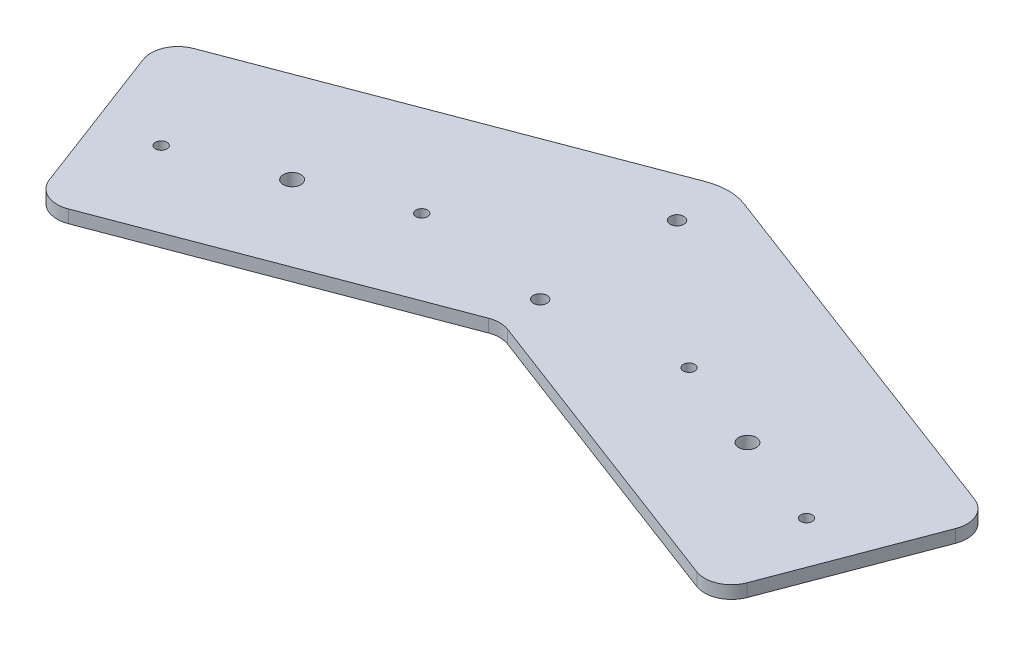
ISO-10303-21;
HEADER;
FILE_DESCRIPTION(('STEP AP214'),'2;1');
FILE_NAME('part.step','',(''),(''),'','','');
FILE_SCHEMA(('AUTOMOTIVE_DESIGN { 1 0 10303 214 1 1 1 1 }'));
ENDSEC;
DATA;
#1=APPLICATION_CONTEXT('core data for automotive mechanical design processes');
#2=APPLICATION_PROTOCOL_DEFINITION('international standard','automotive_design',2000,#1);
#3=PRODUCT_CONTEXT('',#1,'mechanical');
#4=PRODUCT('Part','Part','',(#3));
#5=PRODUCT_RELATED_PRODUCT_CATEGORY('part','',(#4));
#6=PRODUCT_DEFINITION_FORMATION('','',#4);
#7=PRODUCT_DEFINITION_CONTEXT('part definition',#1,'design');
#8=PRODUCT_DEFINITION('design','',#6,#7);
#9=PRODUCT_DEFINITION_SHAPE('','',#8);
#10=(LENGTH_UNIT() NAMED_UNIT(*) SI_UNIT(.MILLI.,.METRE.));
#11=(NAMED_UNIT(*) PLANE_ANGLE_UNIT() SI_UNIT($,.RADIAN.));
#12=(NAMED_UNIT(*) SI_UNIT($,.STERADIAN.) SOLID_ANGLE_UNIT());
#13=UNCERTAINTY_MEASURE_WITH_UNIT(LENGTH_MEASURE(1.E-05),#10,'distance_accuracy_value','');
#14=(GEOMETRIC_REPRESENTATION_CONTEXT(3) GLOBAL_UNCERTAINTY_ASSIGNED_CONTEXT((#13)) GLOBAL_UNIT_ASSIGNED_CONTEXT((#10,
#11,#12)) REPRESENTATION_CONTEXT('',''));
#15=CARTESIAN_POINT('',(0.,0.,0.));
#16=DIRECTION('',(0.,0.,1.));
#17=DIRECTION('',(1.,0.,0.));
#18=AXIS2_PLACEMENT_3D('',#15,#16,#17);
#19=CARTESIAN_POINT('',(0.00013176790799323,0.,-110.207283227998));
#20=DIRECTION('',(0.,-1.,0.));
#21=DIRECTION('',(0.,0.,-1.));
#22=AXIS2_PLACEMENT_3D('',#19,#20,#21);
#23=PLANE('',#22);
#24=CARTESIAN_POINT('',(-2.9012140517437E-06,0.,-111.151797866301));
#25=DIRECTION('',(0.,1.,0.));
#26=DIRECTION('',(0.,0.,1.));
#27=AXIS2_PLACEMENT_3D('',#24,#25,#26);
#28=CIRCLE('',#27,2.5527);
#29=CARTESIAN_POINT('',(-2.9012140517437E-06,0.,-108.599097866301));
#30=VERTEX_POINT('',#29);
#31=EDGE_CURVE('E307',#30,#30,#28,.T.);
#32=ORIENTED_EDGE('',*,*,#31,.F.);
#33=EDGE_LOOP('',(#32));
#34=FACE_BOUND('',#33,.T.);
#35=CARTESIAN_POINT('',(-49.6107508602278,0.,-66.0141406287206));
#36=DIRECTION('',(0.,1.,0.));
#37=DIRECTION('',(0.,0.,1.));
#38=AXIS2_PLACEMENT_3D('',#35,#36,#37);
#39=CIRCLE('',#38,2.15);
#40=CARTESIAN_POINT('',(-49.6107508602278,0.,-63.8641406287206));
#41=VERTEX_POINT('',#40);
#42=EDGE_CURVE('E321',#41,#41,#39,.T.);
#43=ORIENTED_EDGE('',*,*,#42,.F.);
#44=EDGE_LOOP('',(#43));
#45=FACE_BOUND('',#44,.T.);
#46=CARTESIAN_POINT('',(-119.745946152243,0.,-39.4424568157338));
#47=DIRECTION('',(0.,1.,0.));
#48=DIRECTION('',(0.,0.,1.));
#49=AXIS2_PLACEMENT_3D('',#46,#47,#48);
#50=CIRCLE('',#49,2.15);
#51=CARTESIAN_POINT('',(-119.745946152243,0.,-37.2924568157338));
#52=VERTEX_POINT('',#51);
#53=EDGE_CURVE('E329',#52,#52,#50,.T.);
#54=ORIENTED_EDGE('',*,*,#53,.F.);
#55=EDGE_LOOP('',(#54));
#56=FACE_BOUND('',#55,.T.);
#57=CARTESIAN_POINT('',(49.6106662182509,0.,-66.0140000016194));
#58=DIRECTION('',(0.,1.,0.));
#59=DIRECTION('',(0.,0.,1.));
#60=AXIS2_PLACEMENT_3D('',#57,#58,#59);
#61=CIRCLE('',#60,2.15);
#62=CARTESIAN_POINT('',(49.6106662182509,0.,-63.8640000016194));
#63=VERTEX_POINT('',#62);
#64=EDGE_CURVE('E337',#63,#63,#61,.T.);
#65=ORIENTED_EDGE('',*,*,#64,.F.);
#66=EDGE_LOOP('',(#65));
#67=FACE_BOUND('',#66,.T.);
#68=CARTESIAN_POINT('',(119.745752361562,0.,-39.4420281216076));
#69=DIRECTION('',(0.,1.,0.));
#70=DIRECTION('',(0.,0.,1.));
#71=AXIS2_PLACEMENT_3D('',#68,#69,#70);
#72=CIRCLE('',#71,2.15);
#73=CARTESIAN_POINT('',(119.745752361562,0.,-37.2920281216076));
#74=VERTEX_POINT('',#73);
#75=EDGE_CURVE('E345',#74,#74,#72,.T.);
#76=ORIENTED_EDGE('',*,*,#75,.F.);
#77=EDGE_LOOP('',(#76));
#78=FACE_BOUND('',#77,.T.);
#79=CARTESIAN_POINT('',(84.4997864608862,0.,-52.7959249176631));
#80=DIRECTION('',(0.,1.,0.));
#81=DIRECTION('',(0.,0.,1.));
#82=AXIS2_PLACEMENT_3D('',#79,#80,#81);
#83=CIRCLE('',#82,3.26389999999999);
#84=CARTESIAN_POINT('',(84.4997864608862,0.,-49.5320249176631));
#85=VERTEX_POINT('',#84);
#86=EDGE_CURVE('E353',#85,#85,#83,.T.);
#87=ORIENTED_EDGE('',*,*,#86,.F.);
#88=EDGE_LOOP('',(#87));
#89=FACE_BOUND('',#88,.T.);
#90=CARTESIAN_POINT('',(-84.4998511081356,0.,-52.795924917663));
#91=DIRECTION('',(0.,1.,0.));
#92=DIRECTION('',(0.,0.,1.));
#93=AXIS2_PLACEMENT_3D('',#90,#91,#92);
#94=CIRCLE('',#93,3.26389999999999);
#95=CARTESIAN_POINT('',(-84.4998511081356,0.,-49.5320249176631));
#96=VERTEX_POINT('',#95);
#97=EDGE_CURVE('E361',#96,#96,#94,.T.);
#98=ORIENTED_EDGE('',*,*,#97,.F.);
#99=EDGE_LOOP('',(#98));
#100=FACE_BOUND('',#99,.T.);
#101=CARTESIAN_POINT('',(0.00013176790799323,0.,-110.207283227998));
#102=DIRECTION('',(0.,-1.,0.));
#103=DIRECTION('',(0.,0.,-1.));
#104=AXIS2_PLACEMENT_3D('',#101,#102,#103);
#105=CIRCLE('',#104,20.);
#106=CARTESIAN_POINT('',(-7.08565058265872,0.,-128.910001973689));
#107=VERTEX_POINT('',#106);
#108=CARTESIAN_POINT('',(7.08599093722021,0.,-128.909972869669));
#109=VERTEX_POINT('',#108);
#110=EDGE_CURVE('E167',#107,#109,#105,.T.);
#111=ORIENTED_EDGE('',*,*,#110,.F.);
#112=DIRECTION('',(-0.935135937284519,0.,0.354289117528332));
#113=VECTOR('',#112,1.);
#114=CARTESIAN_POINT('',(-7.08565058265872,0.,-128.910001973689));
#115=LINE('',#114,#113);
#116=CARTESIAN_POINT('',(-144.945894588557,0.,-76.6797515430182));
#117=VERTEX_POINT('',#116);
#118=EDGE_CURVE('E208',#107,#117,#115,.T.);
#119=ORIENTED_EDGE('',*,*,#118,.T.);
#120=CARTESIAN_POINT('',(-141.403003413273,0.,-67.3283921701731));
#121=DIRECTION('',(0.,1.,0.));
#122=DIRECTION('',(0.,0.,1.));
#123=AXIS2_PLACEMENT_3D('',#120,#121,#122);
#124=CIRCLE('',#123,9.99999999999998);
#125=CARTESIAN_POINT('',(-150.754362786118,0.,-63.7855009948898));
#126=VERTEX_POINT('',#125);
#127=EDGE_CURVE('E205',#117,#126,#124,.T.);
#128=ORIENTED_EDGE('',*,*,#127,.T.);
#129=DIRECTION('',(0.354289117528333,0.,0.935135937284519));
#130=VECTOR('',#129,1.);
#131=CARTESIAN_POINT('',(-150.754362786118,0.,-63.7855009948898));
#132=LINE('',#131,#130);
#133=CARTESIAN_POINT('',(-129.497015734418,0.,-7.67734475781865));
#134=VERTEX_POINT('',#133);
#135=EDGE_CURVE('E143',#126,#134,#132,.T.);
#136=ORIENTED_EDGE('',*,*,#135,.T.);
#137=CARTESIAN_POINT('',(-120.145656361573,0.,-11.220235933102));
#138=DIRECTION('',(0.,1.,0.));
#139=DIRECTION('',(0.,0.,1.));
#140=AXIS2_PLACEMENT_3D('',#137,#138,#139);
#141=CIRCLE('',#140,10.);
#142=CARTESIAN_POINT('',(-116.60276518629,0.,-1.86887656025678));
#143=VERTEX_POINT('',#142);
#144=EDGE_CURVE('E199',#134,#143,#141,.T.);
#145=ORIENTED_EDGE('',*,*,#144,.T.);
#146=DIRECTION('',(0.935135937284519,0.,-0.354289117528332));
#147=VECTOR('',#146,1.);
#148=CARTESIAN_POINT('',(-116.60276518629,0.,-1.86887656025677));
#149=LINE('',#148,#147);
#150=CARTESIAN_POINT('',(-3.54291313660133,0.,-44.7031572391531));
#151=VERTEX_POINT('',#150);
#152=EDGE_CURVE('E195',#143,#151,#149,.T.);
#153=ORIENTED_EDGE('',*,*,#152,.T.);
#154=CARTESIAN_POINT('',(-2.19613180141298E-05,0.,-35.351797866308));
#155=DIRECTION('',(0.,-1.,0.));
#156=DIRECTION('',(0.,0.,-1.));
#157=AXIS2_PLACEMENT_3D('',#154,#155,#156);
#158=CIRCLE('',#157,9.99999999999999);
#159=CARTESIAN_POINT('',(3.54290762333806,0.,-44.7031426871436));
#160=VERTEX_POINT('',#159);
#161=EDGE_CURVE('E191',#151,#160,#158,.T.);
#162=ORIENTED_EDGE('',*,*,#161,.T.);
#163=DIRECTION('',(0.93513448208356,0.,0.354292958465607));
#164=VECTOR('',#163,1.);
#165=CARTESIAN_POINT('',(3.54290762333805,0.,-44.7031426871436));
#166=LINE('',#165,#164);
#167=CARTESIAN_POINT('',(116.602583736247,0.,-1.86839763105588));
#168=VERTEX_POINT('',#167);
#169=EDGE_CURVE('E187',#160,#168,#166,.T.);
#170=ORIENTED_EDGE('',*,*,#169,.T.);
#171=CARTESIAN_POINT('',(120.145513320903,0.,-11.2197424518915));
#172=DIRECTION('',(0.,1.,0.));
#173=DIRECTION('',(0.,0.,1.));
#174=AXIS2_PLACEMENT_3D('',#171,#172,#173);
#175=CIRCLE('',#174,10.);
#176=CARTESIAN_POINT('',(129.496858141739,0.,-7.6768128672354));
#177=VERTEX_POINT('',#176);
#178=EDGE_CURVE('E183',#168,#177,#175,.T.);
#179=ORIENTED_EDGE('',*,*,#178,.T.);
#180=DIRECTION('',(0.354292958465607,0.,-0.93513448208356));
#181=VECTOR('',#180,1.);
#182=CARTESIAN_POINT('',(129.496858141739,0.,-7.6768128672354));
#183=LINE('',#182,#181);
#184=CARTESIAN_POINT('',(150.754435649675,0.,-63.784881792249));
#185=VERTEX_POINT('',#184);
#186=EDGE_CURVE('E179',#177,#185,#183,.T.);
#187=ORIENTED_EDGE('',*,*,#186,.T.);
#188=CARTESIAN_POINT('',(141.40309082884,0.,-67.3278113769051));
#189=DIRECTION('',(0.,-1.,0.));
#190=DIRECTION('',(0.,0.,-1.));
#191=AXIS2_PLACEMENT_3D('',#188,#189,#190);
#192=CIRCLE('',#191,10.);
#193=CARTESIAN_POINT('',(144.946020413496,0.,-76.6791561977407));
#194=VERTEX_POINT('',#193);
#195=EDGE_CURVE('E175',#194,#185,#192,.T.);
#196=ORIENTED_EDGE('',*,*,#195,.F.);
#197=DIRECTION('',(-0.93513448208356,0.,-0.354292958465607));
#198=VECTOR('',#197,1.);
#199=CARTESIAN_POINT('',(144.946020413496,0.,-76.6791561977407));
#200=LINE('',#199,#198);
#201=EDGE_CURVE('E170',#194,#109,#200,.T.);
#202=ORIENTED_EDGE('',*,*,#201,.T.);
#203=EDGE_LOOP('',(#111,#119,#128,#136,#145,#153,#162,#170,#179,#187,#196,#202));
#204=FACE_BOUND('',#203,.T.);
#205=CARTESIAN_POINT('',(-2.9012140517437E-06,0.,-60.3517978663007));
#206=DIRECTION('',(0.,1.,0.));
#207=DIRECTION('',(0.,0.,1.));
#208=AXIS2_PLACEMENT_3D('',#205,#206,#207);
#209=CIRCLE('',#208,2.5527);
#210=CARTESIAN_POINT('',(-2.9012140517437E-06,0.,-57.7990978663007));
#211=VERTEX_POINT('',#210);
#212=EDGE_CURVE('E311',#211,#211,#209,.T.);
#213=ORIENTED_EDGE('',*,*,#212,.F.);
#214=EDGE_LOOP('',(#213));
#215=FACE_BOUND('',#214,.T.);
#216=ADVANCED_FACE('F42',(#34,#45,#56,#67,#78,#89,#100,#204,#215),#23,.F.);
#217=CARTESIAN_POINT('',(0.00013176790799323,-4.7625,-110.207283227998));
#218=DIRECTION('',(0.,1.,0.));
#219=DIRECTION('',(0.,0.,1.));
#220=AXIS2_PLACEMENT_3D('',#217,#218,#219);
#221=CYLINDRICAL_SURFACE('',#220,20.);
#222=ORIENTED_EDGE('',*,*,#110,.T.);
#223=DIRECTION('',(0.,1.,0.));
#224=VECTOR('',#223,1.);
#225=CARTESIAN_POINT('',(7.08599093722021,-4.7625,-128.909972869669));
#226=LINE('',#225,#224);
#227=CARTESIAN_POINT('',(7.08599093722021,-4.7625,-128.909972869669));
#228=VERTEX_POINT('',#227);
#229=EDGE_CURVE('E11',#228,#109,#226,.T.);
#230=ORIENTED_EDGE('',*,*,#229,.F.);
#231=CARTESIAN_POINT('',(0.00013176790799323,-4.7625,-110.207283227998));
#232=DIRECTION('',(0.,-1.,0.));
#233=DIRECTION('',(0.,0.,-1.));
#234=AXIS2_PLACEMENT_3D('',#231,#232,#233);
#235=CIRCLE('',#234,20.);
#236=CARTESIAN_POINT('',(-7.08565058265872,-4.7625,-128.910001973689));
#237=VERTEX_POINT('',#236);
#238=EDGE_CURVE('E109',#237,#228,#235,.T.);
#239=ORIENTED_EDGE('',*,*,#238,.F.);
#240=DIRECTION('',(0.,1.,0.));
#241=VECTOR('',#240,1.);
#242=CARTESIAN_POINT('',(-7.08565058265872,-4.7625,-128.910001973689));
#243=LINE('',#242,#241);
#244=EDGE_CURVE('E60',#237,#107,#243,.T.);
#245=ORIENTED_EDGE('',*,*,#244,.T.);
#246=EDGE_LOOP('',(#222,#230,#239,#245));
#247=FACE_BOUND('',#246,.T.);
#248=ADVANCED_FACE('F44',(#247),#221,.T.);
#249=CARTESIAN_POINT('',(144.946020413496,-4.7625,-76.6791561977407));
#250=DIRECTION('',(0.354292958465607,0.,-0.93513448208356));
#251=DIRECTION('',(-0.93513448208356,0.,-0.354292958465607));
#252=AXIS2_PLACEMENT_3D('',#249,#250,#251);
#253=PLANE('',#252);
#254=ORIENTED_EDGE('',*,*,#201,.F.);
#255=DIRECTION('',(0.,1.,0.));
#256=VECTOR('',#255,1.);
#257=CARTESIAN_POINT('',(144.946020413496,-4.7625,-76.6791561977407));
#258=LINE('',#257,#256);
#259=CARTESIAN_POINT('',(144.946020413496,-4.7625,-76.6791561977407));
#260=VERTEX_POINT('',#259);
#261=EDGE_CURVE('E52',#260,#194,#258,.T.);
#262=ORIENTED_EDGE('',*,*,#261,.F.);
#263=DIRECTION('',(-0.93513448208356,0.,-0.354292958465607));
#264=VECTOR('',#263,1.);
#265=CARTESIAN_POINT('',(144.946020413496,-4.7625,-76.6791561977407));
#266=LINE('',#265,#264);
#267=EDGE_CURVE('E249',#260,#228,#266,.T.);
#268=ORIENTED_EDGE('',*,*,#267,.T.);
#269=ORIENTED_EDGE('',*,*,#229,.T.);
#270=EDGE_LOOP('',(#254,#262,#268,#269));
#271=FACE_BOUND('',#270,.T.);
#272=ADVANCED_FACE('F248',(#271),#253,.T.);
#273=CARTESIAN_POINT('',(141.40309082884,-4.7625,-67.3278113769051));
#274=DIRECTION('',(0.,1.,0.));
#275=DIRECTION('',(0.,0.,1.));
#276=AXIS2_PLACEMENT_3D('',#273,#274,#275);
#277=CYLINDRICAL_SURFACE('',#276,10.);
#278=ORIENTED_EDGE('',*,*,#195,.T.);
#279=DIRECTION('',(0.,1.,0.));
#280=VECTOR('',#279,1.);
#281=CARTESIAN_POINT('',(150.754435649675,-4.7625,-63.784881792249));
#282=LINE('',#281,#280);
#283=CARTESIAN_POINT('',(150.754435649675,-4.7625,-63.784881792249));
#284=VERTEX_POINT('',#283);
#285=EDGE_CURVE('E233',#284,#185,#282,.T.);
#286=ORIENTED_EDGE('',*,*,#285,.F.);
#287=CARTESIAN_POINT('',(141.40309082884,-4.7625,-67.3278113769051));
#288=DIRECTION('',(0.,-1.,0.));
#289=DIRECTION('',(0.,0.,-1.));
#290=AXIS2_PLACEMENT_3D('',#287,#288,#289);
#291=CIRCLE('',#290,10.);
#292=EDGE_CURVE('E241',#260,#284,#291,.T.);
#293=ORIENTED_EDGE('',*,*,#292,.F.);
#294=ORIENTED_EDGE('',*,*,#261,.T.);
#295=EDGE_LOOP('',(#278,#286,#293,#294));
#296=FACE_BOUND('',#295,.T.);
#297=ADVANCED_FACE('F239',(#296),#277,.T.);
#298=CARTESIAN_POINT('',(129.496858141739,-4.7625,-7.6768128672354));
#299=DIRECTION('',(0.93513448208356,0.,0.354292958465607));
#300=DIRECTION('',(0.354292958465607,0.,-0.93513448208356));
#301=AXIS2_PLACEMENT_3D('',#298,#299,#300);
#302=PLANE('',#301);
#303=ORIENTED_EDGE('',*,*,#186,.F.);
#304=DIRECTION('',(0.,1.,0.));
#305=VECTOR('',#304,1.);
#306=CARTESIAN_POINT('',(129.496858141739,-4.7625,-7.6768128672354));
#307=LINE('',#306,#305);
#308=CARTESIAN_POINT('',(129.496858141739,-4.7625,-7.6768128672354));
#309=VERTEX_POINT('',#308);
#310=EDGE_CURVE('E230',#309,#177,#307,.T.);
#311=ORIENTED_EDGE('',*,*,#310,.F.);
#312=DIRECTION('',(0.354292958465607,0.,-0.93513448208356));
#313=VECTOR('',#312,1.);
#314=CARTESIAN_POINT('',(129.496858141739,-4.7625,-7.6768128672354));
#315=LINE('',#314,#313);
#316=EDGE_CURVE('E374',#309,#284,#315,.T.);
#317=ORIENTED_EDGE('',*,*,#316,.T.);
#318=ORIENTED_EDGE('',*,*,#285,.T.);
#319=EDGE_LOOP('',(#303,#311,#317,#318));
#320=FACE_BOUND('',#319,.T.);
#321=ADVANCED_FACE('F414',(#320),#302,.T.);
#322=CARTESIAN_POINT('',(120.145513320903,-4.7625,-11.2197424518915));
#323=DIRECTION('',(0.,1.,0.));
#324=DIRECTION('',(0.,0.,1.));
#325=AXIS2_PLACEMENT_3D('',#322,#323,#324);
#326=CYLINDRICAL_SURFACE('',#325,10.);
#327=ORIENTED_EDGE('',*,*,#178,.F.);
#328=DIRECTION('',(0.,1.,0.));
#329=VECTOR('',#328,1.);
#330=CARTESIAN_POINT('',(116.602583736247,-4.7625,-1.86839763105588));
#331=LINE('',#330,#329);
#332=CARTESIAN_POINT('',(116.602583736247,-4.7625,-1.86839763105588));
#333=VERTEX_POINT('',#332);
#334=EDGE_CURVE('E227',#333,#168,#331,.T.);
#335=ORIENTED_EDGE('',*,*,#334,.F.);
#336=CARTESIAN_POINT('',(120.145513320903,-4.7625,-11.2197424518915));
#337=DIRECTION('',(0.,1.,0.));
#338=DIRECTION('',(0.,0.,1.));
#339=AXIS2_PLACEMENT_3D('',#336,#337,#338);
#340=CIRCLE('',#339,10.);
#341=EDGE_CURVE('E378',#333,#309,#340,.T.);
#342=ORIENTED_EDGE('',*,*,#341,.T.);
#343=ORIENTED_EDGE('',*,*,#310,.T.);
#344=EDGE_LOOP('',(#327,#335,#342,#343));
#345=FACE_BOUND('',#344,.T.);
#346=ADVANCED_FACE('F410',(#345),#326,.T.);
#347=CARTESIAN_POINT('',(3.54290762333805,-4.7625,-44.7031426871436));
#348=DIRECTION('',(-0.354292958465607,0.,0.93513448208356));
#349=DIRECTION('',(0.93513448208356,0.,0.354292958465607));
#350=AXIS2_PLACEMENT_3D('',#347,#348,#349);
#351=PLANE('',#350);
#352=ORIENTED_EDGE('',*,*,#169,.F.);
#353=DIRECTION('',(0.,1.,0.));
#354=VECTOR('',#353,1.);
#355=CARTESIAN_POINT('',(3.54290762333806,-4.7625,-44.7031426871436));
#356=LINE('',#355,#354);
#357=CARTESIAN_POINT('',(3.54290762333806,-4.7625,-44.7031426871436));
#358=VERTEX_POINT('',#357);
#359=EDGE_CURVE('E224',#358,#160,#356,.T.);
#360=ORIENTED_EDGE('',*,*,#359,.F.);
#361=DIRECTION('',(0.93513448208356,0.,0.354292958465607));
#362=VECTOR('',#361,1.);
#363=CARTESIAN_POINT('',(3.54290762333805,-4.7625,-44.7031426871436));
#364=LINE('',#363,#362);
#365=EDGE_CURVE('E382',#358,#333,#364,.T.);
#366=ORIENTED_EDGE('',*,*,#365,.T.);
#367=ORIENTED_EDGE('',*,*,#334,.T.);
#368=EDGE_LOOP('',(#352,#360,#366,#367));
#369=FACE_BOUND('',#368,.T.);
#370=ADVANCED_FACE('F407',(#369),#351,.T.);
#371=CARTESIAN_POINT('',(-2.19613180141298E-05,-4.7625,-35.351797866308));
#372=DIRECTION('',(0.,1.,0.));
#373=DIRECTION('',(0.,0.,1.));
#374=AXIS2_PLACEMENT_3D('',#371,#372,#373);
#375=CYLINDRICAL_SURFACE('',#374,9.99999999999999);
#376=ORIENTED_EDGE('',*,*,#161,.F.);
#377=DIRECTION('',(0.,1.,0.));
#378=VECTOR('',#377,1.);
#379=CARTESIAN_POINT('',(-3.54291313660133,-4.7625,-44.7031572391531));
#380=LINE('',#379,#378);
#381=CARTESIAN_POINT('',(-3.54291313660133,-4.7625,-44.7031572391531));
#382=VERTEX_POINT('',#381);
#383=EDGE_CURVE('E221',#382,#151,#380,.T.);
#384=ORIENTED_EDGE('',*,*,#383,.F.);
#385=CARTESIAN_POINT('',(-2.19613180141298E-05,-4.7625,-35.351797866308));
#386=DIRECTION('',(0.,-1.,0.));
#387=DIRECTION('',(0.,0.,-1.));
#388=AXIS2_PLACEMENT_3D('',#385,#386,#387);
#389=CIRCLE('',#388,9.99999999999999);
#390=EDGE_CURVE('E386',#382,#358,#389,.T.);
#391=ORIENTED_EDGE('',*,*,#390,.T.);
#392=ORIENTED_EDGE('',*,*,#359,.T.);
#393=EDGE_LOOP('',(#376,#384,#391,#392));
#394=FACE_BOUND('',#393,.T.);
#395=ADVANCED_FACE('F403',(#394),#375,.F.);
#396=CARTESIAN_POINT('',(-116.60276518629,-4.7625,-1.86887656025677));
#397=DIRECTION('',(0.354289117528332,0.,0.935135937284519));
#398=DIRECTION('',(0.935135937284519,0.,-0.354289117528332));
#399=AXIS2_PLACEMENT_3D('',#396,#397,#398);
#400=PLANE('',#399);
#401=ORIENTED_EDGE('',*,*,#152,.F.);
#402=DIRECTION('',(0.,1.,0.));
#403=VECTOR('',#402,1.);
#404=CARTESIAN_POINT('',(-116.60276518629,-4.7625,-1.86887656025678));
#405=LINE('',#404,#403);
#406=CARTESIAN_POINT('',(-116.60276518629,-4.7625,-1.86887656025678));
#407=VERTEX_POINT('',#406);
#408=EDGE_CURVE('E218',#407,#143,#405,.T.);
#409=ORIENTED_EDGE('',*,*,#408,.F.);
#410=DIRECTION('',(0.935135937284519,0.,-0.354289117528332));
#411=VECTOR('',#410,1.);
#412=CARTESIAN_POINT('',(-116.60276518629,-4.7625,-1.86887656025677));
#413=LINE('',#412,#411);
#414=EDGE_CURVE('E390',#407,#382,#413,.T.);
#415=ORIENTED_EDGE('',*,*,#414,.T.);
#416=ORIENTED_EDGE('',*,*,#383,.T.);
#417=EDGE_LOOP('',(#401,#409,#415,#416));
#418=FACE_BOUND('',#417,.T.);
#419=ADVANCED_FACE('F400',(#418),#400,.T.);
#420=CARTESIAN_POINT('',(-120.145656361573,-4.7625,-11.220235933102));
#421=DIRECTION('',(0.,1.,0.));
#422=DIRECTION('',(0.,0.,1.));
#423=AXIS2_PLACEMENT_3D('',#420,#421,#422);
#424=CYLINDRICAL_SURFACE('',#423,10.);
#425=ORIENTED_EDGE('',*,*,#144,.F.);
#426=DIRECTION('',(0.,1.,0.));
#427=VECTOR('',#426,1.);
#428=CARTESIAN_POINT('',(-129.497015734418,-4.7625,-7.67734475781865));
#429=LINE('',#428,#427);
#430=CARTESIAN_POINT('',(-129.497015734418,-4.7625,-7.67734475781865));
#431=VERTEX_POINT('',#430);
#432=EDGE_CURVE('E148',#431,#134,#429,.T.);
#433=ORIENTED_EDGE('',*,*,#432,.F.);
#434=CARTESIAN_POINT('',(-120.145656361573,-4.7625,-11.220235933102));
#435=DIRECTION('',(0.,1.,0.));
#436=DIRECTION('',(0.,0.,1.));
#437=AXIS2_PLACEMENT_3D('',#434,#435,#436);
#438=CIRCLE('',#437,10.);
#439=EDGE_CURVE('E156',#431,#407,#438,.T.);
#440=ORIENTED_EDGE('',*,*,#439,.T.);
#441=ORIENTED_EDGE('',*,*,#408,.T.);
#442=EDGE_LOOP('',(#425,#433,#440,#441));
#443=FACE_BOUND('',#442,.T.);
#444=ADVANCED_FACE('F396',(#443),#424,.T.);
#445=CARTESIAN_POINT('',(-150.754362786118,-4.7625,-63.7855009948898));
#446=DIRECTION('',(-0.935135937284519,0.,0.354289117528333));
#447=DIRECTION('',(0.354289117528333,0.,0.935135937284519));
#448=AXIS2_PLACEMENT_3D('',#445,#446,#447);
#449=PLANE('',#448);
#450=ORIENTED_EDGE('',*,*,#135,.F.);
#451=DIRECTION('',(0.,1.,0.));
#452=VECTOR('',#451,1.);
#453=CARTESIAN_POINT('',(-150.754362786118,-4.7625,-63.7855009948898));
#454=LINE('',#453,#452);
#455=CARTESIAN_POINT('',(-150.754362786118,-4.7625,-63.7855009948898));
#456=VERTEX_POINT('',#455);
#457=EDGE_CURVE('E138',#456,#126,#454,.T.);
#458=ORIENTED_EDGE('',*,*,#457,.F.);
#459=DIRECTION('',(0.354289117528333,0.,0.935135937284519));
#460=VECTOR('',#459,1.);
#461=CARTESIAN_POINT('',(-150.754362786118,-4.7625,-63.7855009948898));
#462=LINE('',#461,#460);
#463=EDGE_CURVE('E141',#456,#431,#462,.T.);
#464=ORIENTED_EDGE('',*,*,#463,.T.);
#465=ORIENTED_EDGE('',*,*,#432,.T.);
#466=EDGE_LOOP('',(#450,#458,#464,#465));
#467=FACE_BOUND('',#466,.T.);
#468=ADVANCED_FACE('F140',(#467),#449,.T.);
#469=CARTESIAN_POINT('',(-141.403003413273,-4.7625,-67.3283921701731));
#470=DIRECTION('',(0.,1.,0.));
#471=DIRECTION('',(0.,0.,1.));
#472=AXIS2_PLACEMENT_3D('',#469,#470,#471);
#473=CYLINDRICAL_SURFACE('',#472,9.99999999999998);
#474=ORIENTED_EDGE('',*,*,#127,.F.);
#475=DIRECTION('',(0.,1.,0.));
#476=VECTOR('',#475,1.);
#477=CARTESIAN_POINT('',(-144.945894588557,-4.7625,-76.6797515430182));
#478=LINE('',#477,#476);
#479=CARTESIAN_POINT('',(-144.945894588557,-4.7625,-76.6797515430182));
#480=VERTEX_POINT('',#479);
#481=EDGE_CURVE('E97',#480,#117,#478,.T.);
#482=ORIENTED_EDGE('',*,*,#481,.F.);
#483=CARTESIAN_POINT('',(-141.403003413273,-4.7625,-67.3283921701731));
#484=DIRECTION('',(0.,1.,0.));
#485=DIRECTION('',(0.,0.,1.));
#486=AXIS2_PLACEMENT_3D('',#483,#484,#485);
#487=CIRCLE('',#486,9.99999999999998);
#488=EDGE_CURVE('E153',#480,#456,#487,.T.);
#489=ORIENTED_EDGE('',*,*,#488,.T.);
#490=ORIENTED_EDGE('',*,*,#457,.T.);
#491=EDGE_LOOP('',(#474,#482,#489,#490));
#492=FACE_BOUND('',#491,.T.);
#493=ADVANCED_FACE('F159',(#492),#473,.T.);
#494=CARTESIAN_POINT('',(-7.08565058265872,-4.7625,-128.910001973689));
#495=DIRECTION('',(-0.354289117528332,0.,-0.935135937284519));
#496=DIRECTION('',(-0.935135937284519,0.,0.354289117528332));
#497=AXIS2_PLACEMENT_3D('',#494,#495,#496);
#498=PLANE('',#497);
#499=ORIENTED_EDGE('',*,*,#118,.F.);
#500=ORIENTED_EDGE('',*,*,#244,.F.);
#501=DIRECTION('',(-0.935135937284519,0.,0.354289117528332));
#502=VECTOR('',#501,1.);
#503=CARTESIAN_POINT('',(-7.08565058265872,-4.7625,-128.910001973689));
#504=LINE('',#503,#502);
#505=EDGE_CURVE('E161',#237,#480,#504,.T.);
#506=ORIENTED_EDGE('',*,*,#505,.T.);
#507=ORIENTED_EDGE('',*,*,#481,.T.);
#508=EDGE_LOOP('',(#499,#500,#506,#507));
#509=FACE_BOUND('',#508,.T.);
#510=ADVANCED_FACE('F250',(#509),#498,.T.);
#511=CARTESIAN_POINT('',(0.00013176790799323,-4.7625,-110.207283227998));
#512=DIRECTION('',(0.,-1.,0.));
#513=DIRECTION('',(0.,0.,-1.));
#514=AXIS2_PLACEMENT_3D('',#511,#512,#513);
#515=PLANE('',#514);
#516=CARTESIAN_POINT('',(-2.9012140517437E-06,-4.7625,-111.151797866301));
#517=DIRECTION('',(0.,1.,0.));
#518=DIRECTION('',(0.,0.,1.));
#519=AXIS2_PLACEMENT_3D('',#516,#517,#518);
#520=CIRCLE('',#519,2.5527);
#521=CARTESIAN_POINT('',(-2.9012140517437E-06,-4.7625,-108.599097866301));
#522=VERTEX_POINT('',#521);
#523=EDGE_CURVE('E305',#522,#522,#520,.T.);
#524=ORIENTED_EDGE('',*,*,#523,.T.);
#525=EDGE_LOOP('',(#524));
#526=FACE_BOUND('',#525,.T.);
#527=CARTESIAN_POINT('',(-2.9012140517437E-06,-4.7625,-60.3517978663007));
#528=DIRECTION('',(0.,1.,0.));
#529=DIRECTION('',(0.,0.,1.));
#530=AXIS2_PLACEMENT_3D('',#527,#528,#529);
#531=CIRCLE('',#530,2.5527);
#532=CARTESIAN_POINT('',(-2.9012140517437E-06,-4.7625,-57.7990978663007));
#533=VERTEX_POINT('',#532);
#534=EDGE_CURVE('E317',#533,#533,#531,.T.);
#535=ORIENTED_EDGE('',*,*,#534,.T.);
#536=EDGE_LOOP('',(#535));
#537=FACE_BOUND('',#536,.T.);
#538=CARTESIAN_POINT('',(-49.6107508602278,-4.7625,-66.0141406287206));
#539=DIRECTION('',(0.,1.,0.));
#540=DIRECTION('',(0.,0.,1.));
#541=AXIS2_PLACEMENT_3D('',#538,#539,#540);
#542=CIRCLE('',#541,2.15);
#543=CARTESIAN_POINT('',(-49.6107508602278,-4.7625,-63.8641406287206));
#544=VERTEX_POINT('',#543);
#545=EDGE_CURVE('E325',#544,#544,#542,.T.);
#546=ORIENTED_EDGE('',*,*,#545,.T.);
#547=EDGE_LOOP('',(#546));
#548=FACE_BOUND('',#547,.T.);
#549=CARTESIAN_POINT('',(-119.745946152243,-4.7625,-39.4424568157338));
#550=DIRECTION('',(0.,1.,0.));
#551=DIRECTION('',(0.,0.,1.));
#552=AXIS2_PLACEMENT_3D('',#549,#550,#551);
#553=CIRCLE('',#552,2.15);
#554=CARTESIAN_POINT('',(-119.745946152243,-4.7625,-37.2924568157338));
#555=VERTEX_POINT('',#554);
#556=EDGE_CURVE('E333',#555,#555,#553,.T.);
#557=ORIENTED_EDGE('',*,*,#556,.T.);
#558=EDGE_LOOP('',(#557));
#559=FACE_BOUND('',#558,.T.);
#560=CARTESIAN_POINT('',(49.6106662182509,-4.7625,-66.0140000016194));
#561=DIRECTION('',(0.,1.,0.));
#562=DIRECTION('',(0.,0.,1.));
#563=AXIS2_PLACEMENT_3D('',#560,#561,#562);
#564=CIRCLE('',#563,2.15);
#565=CARTESIAN_POINT('',(49.6106662182509,-4.7625,-63.8640000016194));
#566=VERTEX_POINT('',#565);
#567=EDGE_CURVE('E341',#566,#566,#564,.T.);
#568=ORIENTED_EDGE('',*,*,#567,.T.);
#569=EDGE_LOOP('',(#568));
#570=FACE_BOUND('',#569,.T.);
#571=CARTESIAN_POINT('',(119.745752361562,-4.7625,-39.4420281216076));
#572=DIRECTION('',(0.,1.,0.));
#573=DIRECTION('',(0.,0.,1.));
#574=AXIS2_PLACEMENT_3D('',#571,#572,#573);
#575=CIRCLE('',#574,2.15);
#576=CARTESIAN_POINT('',(119.745752361562,-4.7625,-37.2920281216076));
#577=VERTEX_POINT('',#576);
#578=EDGE_CURVE('E349',#577,#577,#575,.T.);
#579=ORIENTED_EDGE('',*,*,#578,.T.);
#580=EDGE_LOOP('',(#579));
#581=FACE_BOUND('',#580,.T.);
#582=CARTESIAN_POINT('',(84.4997864608862,-4.7625,-52.7959249176631));
#583=DIRECTION('',(0.,1.,0.));
#584=DIRECTION('',(0.,0.,1.));
#585=AXIS2_PLACEMENT_3D('',#582,#583,#584);
#586=CIRCLE('',#585,3.2639);
#587=CARTESIAN_POINT('',(84.4997864608862,-4.7625,-49.5320249176631));
#588=VERTEX_POINT('',#587);
#589=EDGE_CURVE('E357',#588,#588,#586,.T.);
#590=ORIENTED_EDGE('',*,*,#589,.T.);
#591=EDGE_LOOP('',(#590));
#592=FACE_BOUND('',#591,.T.);
#593=CARTESIAN_POINT('',(-84.4998511081356,-4.7625,-52.795924917663));
#594=DIRECTION('',(0.,1.,0.));
#595=DIRECTION('',(0.,0.,1.));
#596=AXIS2_PLACEMENT_3D('',#593,#594,#595);
#597=CIRCLE('',#596,3.2639);
#598=CARTESIAN_POINT('',(-84.4998511081356,-4.7625,-49.532024917663));
#599=VERTEX_POINT('',#598);
#600=EDGE_CURVE('E171',#599,#599,#597,.T.);
#601=ORIENTED_EDGE('',*,*,#600,.T.);
#602=EDGE_LOOP('',(#601));
#603=FACE_BOUND('',#602,.T.);
#604=ORIENTED_EDGE('',*,*,#238,.T.);
#605=ORIENTED_EDGE('',*,*,#267,.F.);
#606=ORIENTED_EDGE('',*,*,#292,.T.);
#607=ORIENTED_EDGE('',*,*,#316,.F.);
#608=ORIENTED_EDGE('',*,*,#341,.F.);
#609=ORIENTED_EDGE('',*,*,#365,.F.);
#610=ORIENTED_EDGE('',*,*,#390,.F.);
#611=ORIENTED_EDGE('',*,*,#414,.F.);
#612=ORIENTED_EDGE('',*,*,#439,.F.);
#613=ORIENTED_EDGE('',*,*,#463,.F.);
#614=ORIENTED_EDGE('',*,*,#488,.F.);
#615=ORIENTED_EDGE('',*,*,#505,.F.);
#616=EDGE_LOOP('',(#604,#605,#606,#607,#608,#609,#610,#611,#612,#613,#614,#615));
#617=FACE_BOUND('',#616,.T.);
#618=ADVANCED_FACE('F152',(#526,#537,#548,#559,#570,#581,#592,#603,#617),#515,.T.);
#619=CARTESIAN_POINT('',(-84.4998511081356,0.,-52.795924917663));
#620=DIRECTION('',(0.,1.,0.));
#621=DIRECTION('',(0.,0.,1.));
#622=AXIS2_PLACEMENT_3D('',#619,#620,#621);
#623=CYLINDRICAL_SURFACE('',#622,3.26389999999999);
#624=ORIENTED_EDGE('',*,*,#600,.F.);
#625=EDGE_LOOP('',(#624));
#626=FACE_BOUND('',#625,.T.);
#627=ORIENTED_EDGE('',*,*,#97,.T.);
#628=EDGE_LOOP('',(#627));
#629=FACE_BOUND('',#628,.T.);
#630=ADVANCED_FACE('F257',(#626,#629),#623,.F.);
#631=CARTESIAN_POINT('',(84.4997864608862,0.,-52.7959249176631));
#632=DIRECTION('',(0.,1.,0.));
#633=DIRECTION('',(0.,0.,1.));
#634=AXIS2_PLACEMENT_3D('',#631,#632,#633);
#635=CYLINDRICAL_SURFACE('',#634,3.26389999999999);
#636=ORIENTED_EDGE('',*,*,#589,.F.);
#637=EDGE_LOOP('',(#636));
#638=FACE_BOUND('',#637,.T.);
#639=ORIENTED_EDGE('',*,*,#86,.T.);
#640=EDGE_LOOP('',(#639));
#641=FACE_BOUND('',#640,.T.);
#642=ADVANCED_FACE('F272',(#638,#641),#635,.F.);
#643=CARTESIAN_POINT('',(119.745752361562,0.,-39.4420281216076));
#644=DIRECTION('',(0.,1.,0.));
#645=DIRECTION('',(0.,0.,1.));
#646=AXIS2_PLACEMENT_3D('',#643,#644,#645);
#647=CYLINDRICAL_SURFACE('',#646,2.15);
#648=ORIENTED_EDGE('',*,*,#578,.F.);
#649=EDGE_LOOP('',(#648));
#650=FACE_BOUND('',#649,.T.);
#651=ORIENTED_EDGE('',*,*,#75,.T.);
#652=EDGE_LOOP('',(#651));
#653=FACE_BOUND('',#652,.T.);
#654=ADVANCED_FACE('F276',(#650,#653),#647,.F.);
#655=CARTESIAN_POINT('',(49.6106662182509,0.,-66.0140000016194));
#656=DIRECTION('',(0.,1.,0.));
#657=DIRECTION('',(0.,0.,1.));
#658=AXIS2_PLACEMENT_3D('',#655,#656,#657);
#659=CYLINDRICAL_SURFACE('',#658,2.15);
#660=ORIENTED_EDGE('',*,*,#567,.F.);
#661=EDGE_LOOP('',(#660));
#662=FACE_BOUND('',#661,.T.);
#663=ORIENTED_EDGE('',*,*,#64,.T.);
#664=EDGE_LOOP('',(#663));
#665=FACE_BOUND('',#664,.T.);
#666=ADVANCED_FACE('F280',(#662,#665),#659,.F.);
#667=CARTESIAN_POINT('',(-119.745946152243,0.,-39.4424568157338));
#668=DIRECTION('',(0.,1.,0.));
#669=DIRECTION('',(0.,0.,1.));
#670=AXIS2_PLACEMENT_3D('',#667,#668,#669);
#671=CYLINDRICAL_SURFACE('',#670,2.15);
#672=ORIENTED_EDGE('',*,*,#556,.F.);
#673=EDGE_LOOP('',(#672));
#674=FACE_BOUND('',#673,.T.);
#675=ORIENTED_EDGE('',*,*,#53,.T.);
#676=EDGE_LOOP('',(#675));
#677=FACE_BOUND('',#676,.T.);
#678=ADVANCED_FACE('F284',(#674,#677),#671,.F.);
#679=CARTESIAN_POINT('',(-49.6107508602278,0.,-66.0141406287206));
#680=DIRECTION('',(0.,1.,0.));
#681=DIRECTION('',(0.,0.,1.));
#682=AXIS2_PLACEMENT_3D('',#679,#680,#681);
#683=CYLINDRICAL_SURFACE('',#682,2.15);
#684=ORIENTED_EDGE('',*,*,#545,.F.);
#685=EDGE_LOOP('',(#684));
#686=FACE_BOUND('',#685,.T.);
#687=ORIENTED_EDGE('',*,*,#42,.T.);
#688=EDGE_LOOP('',(#687));
#689=FACE_BOUND('',#688,.T.);
#690=ADVANCED_FACE('F288',(#686,#689),#683,.F.);
#691=CARTESIAN_POINT('',(-2.9012140517437E-06,0.,-60.3517978663007));
#692=DIRECTION('',(0.,1.,0.));
#693=DIRECTION('',(0.,0.,1.));
#694=AXIS2_PLACEMENT_3D('',#691,#692,#693);
#695=CYLINDRICAL_SURFACE('',#694,2.5527);
#696=ORIENTED_EDGE('',*,*,#534,.F.);
#697=EDGE_LOOP('',(#696));
#698=FACE_BOUND('',#697,.T.);
#699=ORIENTED_EDGE('',*,*,#212,.T.);
#700=EDGE_LOOP('',(#699));
#701=FACE_BOUND('',#700,.T.);
#702=ADVANCED_FACE('F292',(#698,#701),#695,.F.);
#703=CARTESIAN_POINT('',(-2.9012140517437E-06,0.,-111.151797866301));
#704=DIRECTION('',(0.,1.,0.));
#705=DIRECTION('',(0.,0.,1.));
#706=AXIS2_PLACEMENT_3D('',#703,#704,#705);
#707=CYLINDRICAL_SURFACE('',#706,2.5527);
#708=ORIENTED_EDGE('',*,*,#523,.F.);
#709=EDGE_LOOP('',(#708));
#710=FACE_BOUND('',#709,.T.);
#711=ORIENTED_EDGE('',*,*,#31,.T.);
#712=EDGE_LOOP('',(#711));
#713=FACE_BOUND('',#712,.T.);
#714=ADVANCED_FACE('F296',(#710,#713),#707,.F.);
#715=CLOSED_SHELL('',(#216,#248,#272,#297,#321,#346,#370,#395,#419,#444,#468,#493,#510,#618,
#630,#642,#654,#666,#678,#690,#702,#714));
#716=MANIFOLD_SOLID_BREP('B2',#715);
#717=ADVANCED_BREP_SHAPE_REPRESENTATION('',(#18,#716),#14);
#718=SHAPE_DEFINITION_REPRESENTATION(#9,#717);
ENDSEC;
END-ISO-10303-21;
